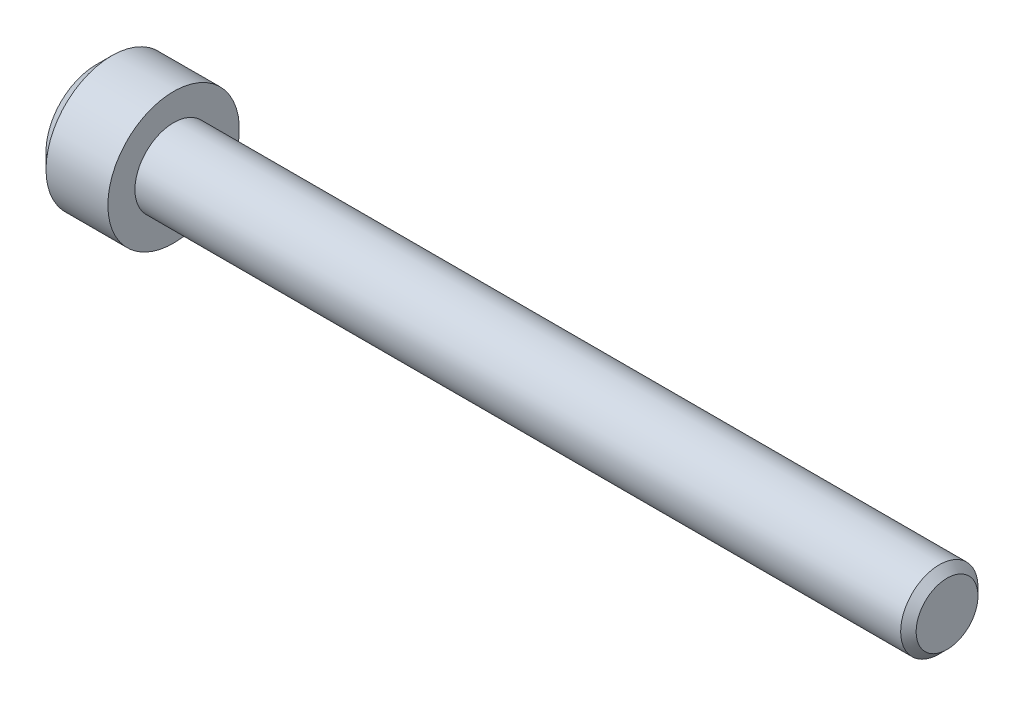
ISO-10303-21;
HEADER;
FILE_DESCRIPTION(('STEP AP214'),'2;1');
FILE_NAME('part.step','',(''),(''),'','','');
FILE_SCHEMA(('AUTOMOTIVE_DESIGN { 1 0 10303 214 1 1 1 1 }'));
ENDSEC;
DATA;
#1=APPLICATION_CONTEXT('core data for automotive mechanical design processes');
#2=APPLICATION_PROTOCOL_DEFINITION('international standard','automotive_design',2000,#1);
#3=PRODUCT_CONTEXT('',#1,'mechanical');
#4=PRODUCT('Part','Part','',(#3));
#5=PRODUCT_RELATED_PRODUCT_CATEGORY('part','',(#4));
#6=PRODUCT_DEFINITION_FORMATION('','',#4);
#7=PRODUCT_DEFINITION_CONTEXT('part definition',#1,'design');
#8=PRODUCT_DEFINITION('design','',#6,#7);
#9=PRODUCT_DEFINITION_SHAPE('','',#8);
#10=(LENGTH_UNIT() NAMED_UNIT(*) SI_UNIT(.MILLI.,.METRE.));
#11=(NAMED_UNIT(*) PLANE_ANGLE_UNIT() SI_UNIT($,.RADIAN.));
#12=(NAMED_UNIT(*) SI_UNIT($,.STERADIAN.) SOLID_ANGLE_UNIT());
#13=UNCERTAINTY_MEASURE_WITH_UNIT(LENGTH_MEASURE(1.E-05),#10,'distance_accuracy_value','');
#14=(GEOMETRIC_REPRESENTATION_CONTEXT(3) GLOBAL_UNCERTAINTY_ASSIGNED_CONTEXT((#13)) GLOBAL_UNIT_ASSIGNED_CONTEXT((#10,
#11,#12)) REPRESENTATION_CONTEXT('',''));
#15=CARTESIAN_POINT('',(0.,0.,0.));
#16=DIRECTION('',(0.,0.,1.));
#17=DIRECTION('',(1.,0.,0.));
#18=AXIS2_PLACEMENT_3D('',#15,#16,#17);
#19=CARTESIAN_POINT('',(0.,0.,0.));
#20=DIRECTION('',(-1.,0.,0.));
#21=DIRECTION('',(0.,0.,1.));
#22=AXIS2_PLACEMENT_3D('',#19,#20,#21);
#23=PLANE('',#22);
#24=CARTESIAN_POINT('',(0.,0.,0.));
#25=DIRECTION('',(-1.,0.,0.));
#26=DIRECTION('',(0.,0.,1.));
#27=AXIS2_PLACEMENT_3D('',#24,#25,#26);
#28=CIRCLE('',#27,2.00000000000001);
#29=CARTESIAN_POINT('',(0.,0.,2.00000000000001));
#30=VERTEX_POINT('',#29);
#31=EDGE_CURVE('E158',#30,#30,#28,.F.);
#32=ORIENTED_EDGE('',*,*,#31,.T.);
#33=EDGE_LOOP('',(#32));
#34=FACE_BOUND('',#33,.T.);
#35=ADVANCED_FACE('F51',(#34),#23,.F.);
#36=CARTESIAN_POINT('',(0.,0.,0.));
#37=DIRECTION('',(-1.,0.,0.));
#38=DIRECTION('',(0.,0.,1.));
#39=AXIS2_PLACEMENT_3D('',#36,#37,#38);
#40=CYLINDRICAL_SURFACE('',#39,2.5);
#41=CARTESIAN_POINT('',(-0.499999999999994,0.,0.));
#42=DIRECTION('',(-1.,0.,0.));
#43=DIRECTION('',(0.,0.,1.));
#44=AXIS2_PLACEMENT_3D('',#41,#42,#43);
#45=CIRCLE('',#44,2.5);
#46=CARTESIAN_POINT('',(-0.499999999999994,0.,2.5));
#47=VERTEX_POINT('',#46);
#48=EDGE_CURVE('E154',#47,#47,#45,.T.);
#49=ORIENTED_EDGE('',*,*,#48,.T.);
#50=EDGE_LOOP('',(#49));
#51=FACE_BOUND('',#50,.T.);
#52=CARTESIAN_POINT('',(-50.,0.,0.));
#53=DIRECTION('',(-1.,0.,0.));
#54=DIRECTION('',(0.,0.,1.));
#55=AXIS2_PLACEMENT_3D('',#52,#53,#54);
#56=CIRCLE('',#55,2.49999999999999);
#57=CARTESIAN_POINT('',(-50.,0.,2.49999999999999));
#58=VERTEX_POINT('',#57);
#59=EDGE_CURVE('E150',#58,#58,#56,.T.);
#60=ORIENTED_EDGE('',*,*,#59,.F.);
#61=EDGE_LOOP('',(#60));
#62=FACE_BOUND('',#61,.T.);
#63=ADVANCED_FACE('F184',(#51,#62),#40,.T.);
#64=CARTESIAN_POINT('',(-50.,2.49999999999999,0.));
#65=DIRECTION('',(-1.,0.,0.));
#66=DIRECTION('',(0.,0.,1.));
#67=AXIS2_PLACEMENT_3D('',#64,#65,#66);
#68=PLANE('',#67);
#69=CARTESIAN_POINT('',(-50.,0.,0.));
#70=DIRECTION('',(-1.,0.,0.));
#71=DIRECTION('',(0.,0.,1.));
#72=AXIS2_PLACEMENT_3D('',#69,#70,#71);
#73=CIRCLE('',#72,4.25);
#74=CARTESIAN_POINT('',(-50.,0.,4.25));
#75=VERTEX_POINT('',#74);
#76=EDGE_CURVE('E134',#75,#75,#73,.T.);
#77=ORIENTED_EDGE('',*,*,#76,.F.);
#78=EDGE_LOOP('',(#77));
#79=FACE_BOUND('',#78,.T.);
#80=ORIENTED_EDGE('',*,*,#59,.T.);
#81=EDGE_LOOP('',(#80));
#82=FACE_BOUND('',#81,.T.);
#83=ADVANCED_FACE('F190',(#79,#82),#68,.F.);
#84=CARTESIAN_POINT('',(0.,0.,0.));
#85=DIRECTION('',(-1.,0.,0.));
#86=DIRECTION('',(0.,0.,1.));
#87=AXIS2_PLACEMENT_3D('',#84,#85,#86);
#88=CYLINDRICAL_SURFACE('',#87,4.25);
#89=CARTESIAN_POINT('',(-54.,0.,0.));
#90=DIRECTION('',(1.,0.,0.));
#91=DIRECTION('',(0.,0.,-1.));
#92=AXIS2_PLACEMENT_3D('',#89,#90,#91);
#93=CIRCLE('',#92,4.25);
#94=CARTESIAN_POINT('',(-54.,0.,-4.25));
#95=VERTEX_POINT('',#94);
#96=EDGE_CURVE('E11',#95,#95,#93,.T.);
#97=ORIENTED_EDGE('',*,*,#96,.T.);
#98=EDGE_LOOP('',(#97));
#99=FACE_BOUND('',#98,.T.);
#100=ORIENTED_EDGE('',*,*,#76,.T.);
#101=EDGE_LOOP('',(#100));
#102=FACE_BOUND('',#101,.T.);
#103=ADVANCED_FACE('F203',(#99,#102),#88,.T.);
#104=CARTESIAN_POINT('',(-55.,4.25,0.));
#105=DIRECTION('',(1.,0.,0.));
#106=DIRECTION('',(0.,0.,-1.));
#107=AXIS2_PLACEMENT_3D('',#104,#105,#106);
#108=PLANE('',#107);
#109=CARTESIAN_POINT('',(-55.,0.,0.));
#110=DIRECTION('',(1.,0.,0.));
#111=DIRECTION('',(0.,0.,-1.));
#112=AXIS2_PLACEMENT_3D('',#109,#110,#111);
#113=CIRCLE('',#112,3.25);
#114=CARTESIAN_POINT('',(-55.,0.,-3.25));
#115=VERTEX_POINT('',#114);
#116=EDGE_CURVE('E60',#115,#115,#113,.F.);
#117=ORIENTED_EDGE('',*,*,#116,.T.);
#118=EDGE_LOOP('',(#117));
#119=FACE_BOUND('',#118,.T.);
#120=DIRECTION('',(0.,-0.5,-0.866025403784439));
#121=VECTOR('',#120,1.);
#122=CARTESIAN_POINT('',(-55.,2.3094010767585,0.));
#123=LINE('',#122,#121);
#124=CARTESIAN_POINT('',(-55.,2.3094010767585,0.));
#125=VERTEX_POINT('',#124);
#126=CARTESIAN_POINT('',(-55.,1.15470053837925,-2.));
#127=VERTEX_POINT('',#126);
#128=EDGE_CURVE('E428',#125,#127,#123,.T.);
#129=ORIENTED_EDGE('',*,*,#128,.F.);
#130=DIRECTION('',(0.,0.5,-0.866025403784439));
#131=VECTOR('',#130,1.);
#132=CARTESIAN_POINT('',(-55.,1.15470053837925,2.));
#133=LINE('',#132,#131);
#134=CARTESIAN_POINT('',(-55.,1.15470053837925,2.));
#135=VERTEX_POINT('',#134);
#136=EDGE_CURVE('E67',#135,#125,#133,.T.);
#137=ORIENTED_EDGE('',*,*,#136,.F.);
#138=DIRECTION('',(0.,1.,0.));
#139=VECTOR('',#138,1.);
#140=CARTESIAN_POINT('',(-55.,-1.15470053837925,2.));
#141=LINE('',#140,#139);
#142=CARTESIAN_POINT('',(-55.,-1.15470053837925,2.));
#143=VERTEX_POINT('',#142);
#144=EDGE_CURVE('E102',#143,#135,#141,.T.);
#145=ORIENTED_EDGE('',*,*,#144,.F.);
#146=DIRECTION('',(0.,0.5,0.866025403784439));
#147=VECTOR('',#146,1.);
#148=CARTESIAN_POINT('',(-55.,-2.3094010767585,0.));
#149=LINE('',#148,#147);
#150=CARTESIAN_POINT('',(-55.,-2.3094010767585,0.));
#151=VERTEX_POINT('',#150);
#152=EDGE_CURVE('E111',#151,#143,#149,.T.);
#153=ORIENTED_EDGE('',*,*,#152,.F.);
#154=DIRECTION('',(0.,-0.5,0.866025403784439));
#155=VECTOR('',#154,1.);
#156=CARTESIAN_POINT('',(-55.,-1.15470053837925,-2.));
#157=LINE('',#156,#155);
#158=CARTESIAN_POINT('',(-55.,-1.15470053837925,-2.));
#159=VERTEX_POINT('',#158);
#160=EDGE_CURVE('E118',#159,#151,#157,.T.);
#161=ORIENTED_EDGE('',*,*,#160,.F.);
#162=DIRECTION('',(0.,-1.,0.));
#163=VECTOR('',#162,1.);
#164=CARTESIAN_POINT('',(-55.,1.15470053837925,-2.));
#165=LINE('',#164,#163);
#166=EDGE_CURVE('E432',#127,#159,#165,.T.);
#167=ORIENTED_EDGE('',*,*,#166,.F.);
#168=EDGE_LOOP('',(#129,#137,#145,#153,#161,#167));
#169=FACE_BOUND('',#168,.T.);
#170=ADVANCED_FACE('F121',(#119,#169),#108,.F.);
#171=CARTESIAN_POINT('',(-0.499999999999994,0.,0.));
#172=DIRECTION('',(-1.,0.,0.));
#173=DIRECTION('',(0.,0.,1.));
#174=AXIS2_PLACEMENT_3D('',#171,#172,#173);
#175=CONICAL_SURFACE('',#174,2.5,0.785398163397443);
#176=ORIENTED_EDGE('',*,*,#31,.F.);
#177=EDGE_LOOP('',(#176));
#178=FACE_BOUND('',#177,.T.);
#179=ORIENTED_EDGE('',*,*,#48,.F.);
#180=EDGE_LOOP('',(#179));
#181=FACE_BOUND('',#180,.T.);
#182=ADVANCED_FACE('F194',(#178,#181),#175,.T.);
#183=CARTESIAN_POINT('',(-52.5,1.15470053837925,2.));
#184=DIRECTION('',(0.,0.866025403784439,0.5));
#185=DIRECTION('',(0.,-0.5,0.866025403784439));
#186=AXIS2_PLACEMENT_3D('',#183,#184,#185);
#187=PLANE('',#186);
#188=ORIENTED_EDGE('',*,*,#136,.T.);
#189=DIRECTION('',(-1.,0.,0.));
#190=VECTOR('',#189,1.);
#191=CARTESIAN_POINT('',(-52.5,2.3094010767585,0.));
#192=LINE('',#191,#190);
#193=CARTESIAN_POINT('',(-52.5,2.3094010767585,0.));
#194=VERTEX_POINT('',#193);
#195=EDGE_CURVE('E144',#194,#125,#192,.T.);
#196=ORIENTED_EDGE('',*,*,#195,.F.);
#197=DIRECTION('',(0.,0.5,-0.866025403784439));
#198=VECTOR('',#197,1.);
#199=CARTESIAN_POINT('',(-52.5,1.15470053837925,2.));
#200=LINE('',#199,#198);
#201=CARTESIAN_POINT('',(-52.5,1.15470053837925,2.));
#202=VERTEX_POINT('',#201);
#203=EDGE_CURVE('E123',#202,#194,#200,.T.);
#204=ORIENTED_EDGE('',*,*,#203,.F.);
#205=DIRECTION('',(-1.,0.,0.));
#206=VECTOR('',#205,1.);
#207=CARTESIAN_POINT('',(-52.5,1.15470053837925,2.));
#208=LINE('',#207,#206);
#209=EDGE_CURVE('E107',#202,#135,#208,.T.);
#210=ORIENTED_EDGE('',*,*,#209,.T.);
#211=EDGE_LOOP('',(#188,#196,#204,#210));
#212=FACE_BOUND('',#211,.T.);
#213=ADVANCED_FACE('F196',(#212),#187,.F.);
#214=CARTESIAN_POINT('',(-52.5,-1.15470053837925,2.));
#215=DIRECTION('',(0.,0.,1.));
#216=DIRECTION('',(0.,-1.,0.));
#217=AXIS2_PLACEMENT_3D('',#214,#215,#216);
#218=PLANE('',#217);
#219=ORIENTED_EDGE('',*,*,#144,.T.);
#220=ORIENTED_EDGE('',*,*,#209,.F.);
#221=DIRECTION('',(0.,1.,0.));
#222=VECTOR('',#221,1.);
#223=CARTESIAN_POINT('',(-52.5,-1.15470053837925,2.));
#224=LINE('',#223,#222);
#225=CARTESIAN_POINT('',(-52.5,-1.15470053837925,2.));
#226=VERTEX_POINT('',#225);
#227=EDGE_CURVE('E104',#226,#202,#224,.T.);
#228=ORIENTED_EDGE('',*,*,#227,.F.);
#229=DIRECTION('',(-1.,0.,0.));
#230=VECTOR('',#229,1.);
#231=CARTESIAN_POINT('',(-52.5,-1.15470053837925,2.));
#232=LINE('',#231,#230);
#233=EDGE_CURVE('E97',#226,#143,#232,.T.);
#234=ORIENTED_EDGE('',*,*,#233,.T.);
#235=EDGE_LOOP('',(#219,#220,#228,#234));
#236=FACE_BOUND('',#235,.T.);
#237=ADVANCED_FACE('F99',(#236),#218,.F.);
#238=CARTESIAN_POINT('',(-52.5,-2.3094010767585,0.));
#239=DIRECTION('',(0.,-0.866025403784439,0.5));
#240=DIRECTION('',(0.,-0.5,-0.866025403784439));
#241=AXIS2_PLACEMENT_3D('',#238,#239,#240);
#242=PLANE('',#241);
#243=ORIENTED_EDGE('',*,*,#152,.T.);
#244=ORIENTED_EDGE('',*,*,#233,.F.);
#245=DIRECTION('',(0.,0.5,0.866025403784439));
#246=VECTOR('',#245,1.);
#247=CARTESIAN_POINT('',(-52.5,-2.3094010767585,0.));
#248=LINE('',#247,#246);
#249=CARTESIAN_POINT('',(-52.5,-2.3094010767585,0.));
#250=VERTEX_POINT('',#249);
#251=EDGE_CURVE('E76',#250,#226,#248,.T.);
#252=ORIENTED_EDGE('',*,*,#251,.F.);
#253=DIRECTION('',(-1.,0.,0.));
#254=VECTOR('',#253,1.);
#255=CARTESIAN_POINT('',(-52.5,-2.3094010767585,0.));
#256=LINE('',#255,#254);
#257=EDGE_CURVE('E108',#250,#151,#256,.T.);
#258=ORIENTED_EDGE('',*,*,#257,.T.);
#259=EDGE_LOOP('',(#243,#244,#252,#258));
#260=FACE_BOUND('',#259,.T.);
#261=ADVANCED_FACE('F112',(#260),#242,.F.);
#262=CARTESIAN_POINT('',(-52.5,-1.15470053837925,-2.));
#263=DIRECTION('',(0.,-0.866025403784439,-0.5));
#264=DIRECTION('',(0.,0.5,-0.866025403784439));
#265=AXIS2_PLACEMENT_3D('',#262,#263,#264);
#266=PLANE('',#265);
#267=ORIENTED_EDGE('',*,*,#160,.T.);
#268=ORIENTED_EDGE('',*,*,#257,.F.);
#269=DIRECTION('',(0.,-0.5,0.866025403784439));
#270=VECTOR('',#269,1.);
#271=CARTESIAN_POINT('',(-52.5,-1.15470053837925,-2.));
#272=LINE('',#271,#270);
#273=CARTESIAN_POINT('',(-52.5,-1.15470053837925,-2.));
#274=VERTEX_POINT('',#273);
#275=EDGE_CURVE('E421',#274,#250,#272,.T.);
#276=ORIENTED_EDGE('',*,*,#275,.F.);
#277=DIRECTION('',(-1.,0.,0.));
#278=VECTOR('',#277,1.);
#279=CARTESIAN_POINT('',(-52.5,-1.15470053837925,-2.));
#280=LINE('',#279,#278);
#281=EDGE_CURVE('E138',#274,#159,#280,.T.);
#282=ORIENTED_EDGE('',*,*,#281,.T.);
#283=EDGE_LOOP('',(#267,#268,#276,#282));
#284=FACE_BOUND('',#283,.T.);
#285=ADVANCED_FACE('F222',(#284),#266,.F.);
#286=CARTESIAN_POINT('',(-52.5,1.15470053837925,-2.));
#287=DIRECTION('',(0.,0.,-1.));
#288=DIRECTION('',(-1.,0.,0.));
#289=AXIS2_PLACEMENT_3D('',#286,#287,#288);
#290=PLANE('',#289);
#291=ORIENTED_EDGE('',*,*,#166,.T.);
#292=ORIENTED_EDGE('',*,*,#281,.F.);
#293=DIRECTION('',(0.,-1.,0.));
#294=VECTOR('',#293,1.);
#295=CARTESIAN_POINT('',(-52.5,1.15470053837925,-2.));
#296=LINE('',#295,#294);
#297=CARTESIAN_POINT('',(-52.5,1.15470053837925,-2.));
#298=VERTEX_POINT('',#297);
#299=EDGE_CURVE('E418',#298,#274,#296,.T.);
#300=ORIENTED_EDGE('',*,*,#299,.F.);
#301=DIRECTION('',(-1.,0.,0.));
#302=VECTOR('',#301,1.);
#303=CARTESIAN_POINT('',(-52.5,1.15470053837925,-2.));
#304=LINE('',#303,#302);
#305=EDGE_CURVE('E141',#298,#127,#304,.T.);
#306=ORIENTED_EDGE('',*,*,#305,.T.);
#307=EDGE_LOOP('',(#291,#292,#300,#306));
#308=FACE_BOUND('',#307,.T.);
#309=ADVANCED_FACE('F179',(#308),#290,.F.);
#310=CARTESIAN_POINT('',(-52.5,2.3094010767585,0.));
#311=DIRECTION('',(0.,0.866025403784439,-0.5));
#312=DIRECTION('',(0.,0.5,0.866025403784439));
#313=AXIS2_PLACEMENT_3D('',#310,#311,#312);
#314=PLANE('',#313);
#315=ORIENTED_EDGE('',*,*,#128,.T.);
#316=ORIENTED_EDGE('',*,*,#305,.F.);
#317=DIRECTION('',(0.,-0.5,-0.866025403784439));
#318=VECTOR('',#317,1.);
#319=CARTESIAN_POINT('',(-52.5,2.3094010767585,0.));
#320=LINE('',#319,#318);
#321=EDGE_CURVE('E129',#194,#298,#320,.T.);
#322=ORIENTED_EDGE('',*,*,#321,.F.);
#323=ORIENTED_EDGE('',*,*,#195,.T.);
#324=EDGE_LOOP('',(#315,#316,#322,#323));
#325=FACE_BOUND('',#324,.T.);
#326=ADVANCED_FACE('F170',(#325),#314,.F.);
#327=CARTESIAN_POINT('',(-55.,0.,0.));
#328=DIRECTION('',(1.,0.,0.));
#329=DIRECTION('',(0.,0.,-1.));
#330=AXIS2_PLACEMENT_3D('',#327,#328,#329);
#331=CONICAL_SURFACE('',#330,3.25,0.785398163397443);
#332=ORIENTED_EDGE('',*,*,#96,.F.);
#333=EDGE_LOOP('',(#332));
#334=FACE_BOUND('',#333,.T.);
#335=ORIENTED_EDGE('',*,*,#116,.F.);
#336=EDGE_LOOP('',(#335));
#337=FACE_BOUND('',#336,.T.);
#338=ADVANCED_FACE('F53',(#334,#337),#331,.T.);
#339=CARTESIAN_POINT('',(-52.5,-1.15470053837925,-2.));
#340=DIRECTION('',(0.857167300702113,-0.446036056788338,-0.257519037455026));
#341=DIRECTION('',(0.461604487477352,0.887085845417889,0.));
#342=AXIS2_PLACEMENT_3D('',#339,#340,#341);
#343=PLANE('',#342);
#344=ORIENTED_EDGE('',*,*,#275,.T.);
#345=DIRECTION('',(-0.461604487477352,-0.887085845417889,0.));
#346=VECTOR('',#345,1.);
#347=CARTESIAN_POINT('',(-52.027169982274,-1.40074263128796,0.));
#348=LINE('',#347,#346);
#349=CARTESIAN_POINT('',(-51.2982787619449,0.,0.));
#350=VERTEX_POINT('',#349);
#351=EDGE_CURVE('E442',#350,#250,#348,.T.);
#352=ORIENTED_EDGE('',*,*,#351,.F.);
#353=DIRECTION('',(-0.461604487477352,-0.443542922708944,-0.768238877469488));
#354=VECTOR('',#353,1.);
#355=CARTESIAN_POINT('',(-52.027169982274,-0.700371315643979,-1.21307870285923));
#356=LINE('',#355,#354);
#357=EDGE_CURVE('E402',#350,#274,#356,.T.);
#358=ORIENTED_EDGE('',*,*,#357,.T.);
#359=EDGE_LOOP('',(#344,#352,#358));
#360=FACE_BOUND('',#359,.T.);
#361=ADVANCED_FACE('F169',(#360),#343,.F.);
#362=CARTESIAN_POINT('',(-52.5,1.15470053837925,-2.));
#363=DIRECTION('',(0.857167300702113,0.,-0.515038074910052));
#364=DIRECTION('',(-0.515038074910052,0.,-0.857167300702113));
#365=AXIS2_PLACEMENT_3D('',#362,#363,#364);
#366=PLANE('',#365);
#367=ORIENTED_EDGE('',*,*,#299,.T.);
#368=ORIENTED_EDGE('',*,*,#357,.F.);
#369=DIRECTION('',(-0.461604487477352,0.443542922708945,-0.768238877469487));
#370=VECTOR('',#369,1.);
#371=CARTESIAN_POINT('',(-52.027169982274,0.700371315643978,-1.21307870285923));
#372=LINE('',#371,#370);
#373=EDGE_CURVE('E404',#350,#298,#372,.T.);
#374=ORIENTED_EDGE('',*,*,#373,.T.);
#375=EDGE_LOOP('',(#367,#368,#374));
#376=FACE_BOUND('',#375,.T.);
#377=ADVANCED_FACE('F176',(#376),#366,.F.);
#378=CARTESIAN_POINT('',(-52.5,2.3094010767585,0.));
#379=DIRECTION('',(0.857167300702113,0.446036056788338,-0.257519037455026));
#380=DIRECTION('',(-0.461604487477352,0.887085845417889,0.));
#381=AXIS2_PLACEMENT_3D('',#378,#379,#380);
#382=PLANE('',#381);
#383=ORIENTED_EDGE('',*,*,#321,.T.);
#384=ORIENTED_EDGE('',*,*,#373,.F.);
#385=DIRECTION('',(-0.461604487477352,0.887085845417889,0.));
#386=VECTOR('',#385,1.);
#387=CARTESIAN_POINT('',(-52.027169982274,1.40074263128796,0.));
#388=LINE('',#387,#386);
#389=EDGE_CURVE('E389',#350,#194,#388,.T.);
#390=ORIENTED_EDGE('',*,*,#389,.T.);
#391=EDGE_LOOP('',(#383,#384,#390));
#392=FACE_BOUND('',#391,.T.);
#393=ADVANCED_FACE('F233',(#392),#382,.F.);
#394=CARTESIAN_POINT('',(-52.5,1.15470053837925,2.));
#395=DIRECTION('',(0.857167300702113,0.446036056788338,0.257519037455026));
#396=DIRECTION('',(-0.461604487477352,0.887085845417889,0.));
#397=AXIS2_PLACEMENT_3D('',#394,#395,#396);
#398=PLANE('',#397);
#399=ORIENTED_EDGE('',*,*,#203,.T.);
#400=ORIENTED_EDGE('',*,*,#389,.F.);
#401=DIRECTION('',(-0.461604487477352,0.443542922708944,0.768238877469488));
#402=VECTOR('',#401,1.);
#403=CARTESIAN_POINT('',(-52.027169982274,0.700371315643978,1.21307870285923));
#404=LINE('',#403,#402);
#405=EDGE_CURVE('E378',#350,#202,#404,.T.);
#406=ORIENTED_EDGE('',*,*,#405,.T.);
#407=EDGE_LOOP('',(#399,#400,#406));
#408=FACE_BOUND('',#407,.T.);
#409=ADVANCED_FACE('F237',(#408),#398,.F.);
#410=CARTESIAN_POINT('',(-52.5,-1.15470053837925,2.));
#411=DIRECTION('',(0.857167300702113,0.,0.515038074910052));
#412=DIRECTION('',(0.515038074910052,0.,-0.857167300702114));
#413=AXIS2_PLACEMENT_3D('',#410,#411,#412);
#414=PLANE('',#413);
#415=ORIENTED_EDGE('',*,*,#227,.T.);
#416=ORIENTED_EDGE('',*,*,#405,.F.);
#417=DIRECTION('',(-0.461604487477352,-0.443542922708945,0.768238877469488));
#418=VECTOR('',#417,1.);
#419=CARTESIAN_POINT('',(-52.027169982274,-0.700371315643978,1.21307870285923));
#420=LINE('',#419,#418);
#421=EDGE_CURVE('E379',#350,#226,#420,.T.);
#422=ORIENTED_EDGE('',*,*,#421,.T.);
#423=EDGE_LOOP('',(#415,#416,#422));
#424=FACE_BOUND('',#423,.T.);
#425=ADVANCED_FACE('F241',(#424),#414,.F.);
#426=CARTESIAN_POINT('',(-52.5,-2.3094010767585,0.));
#427=DIRECTION('',(0.857167300702113,-0.446036056788338,0.257519037455026));
#428=DIRECTION('',(0.461604487477352,0.887085845417889,0.));
#429=AXIS2_PLACEMENT_3D('',#426,#427,#428);
#430=PLANE('',#429);
#431=ORIENTED_EDGE('',*,*,#251,.T.);
#432=ORIENTED_EDGE('',*,*,#421,.F.);
#433=ORIENTED_EDGE('',*,*,#351,.T.);
#434=EDGE_LOOP('',(#431,#432,#433));
#435=FACE_BOUND('',#434,.T.);
#436=ADVANCED_FACE('F245',(#435),#430,.F.);
#437=CLOSED_SHELL('',(#35,#63,#83,#103,#170,#182,#213,#237,#261,#285,#309,#326,#338,#361,#377,
#393,#409,#425,#436));
#438=MANIFOLD_SOLID_BREP('B2',#437);
#439=ADVANCED_BREP_SHAPE_REPRESENTATION('',(#18,#438),#14);
#440=SHAPE_DEFINITION_REPRESENTATION(#9,#439);
ENDSEC;
END-ISO-10303-21;
